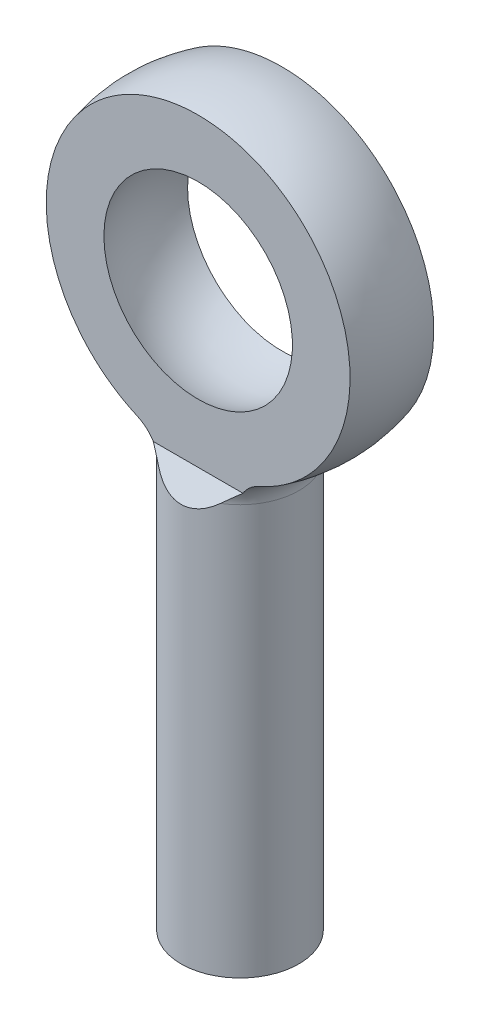
ISO-10303-21;
HEADER;
FILE_DESCRIPTION(('STEP AP214'),'2;1');
FILE_NAME('part.step','',(''),(''),'','','');
FILE_SCHEMA(('AUTOMOTIVE_DESIGN { 1 0 10303 214 1 1 1 1 }'));
ENDSEC;
DATA;
#1=APPLICATION_CONTEXT('core data for automotive mechanical design processes');
#2=APPLICATION_PROTOCOL_DEFINITION('international standard','automotive_design',2000,#1);
#3=PRODUCT_CONTEXT('',#1,'mechanical');
#4=PRODUCT('Part','Part','',(#3));
#5=PRODUCT_RELATED_PRODUCT_CATEGORY('part','',(#4));
#6=PRODUCT_DEFINITION_FORMATION('','',#4);
#7=PRODUCT_DEFINITION_CONTEXT('part definition',#1,'design');
#8=PRODUCT_DEFINITION('design','',#6,#7);
#9=PRODUCT_DEFINITION_SHAPE('','',#8);
#10=(LENGTH_UNIT() NAMED_UNIT(*) SI_UNIT(.MILLI.,.METRE.));
#11=(NAMED_UNIT(*) PLANE_ANGLE_UNIT() SI_UNIT($,.RADIAN.));
#12=(NAMED_UNIT(*) SI_UNIT($,.STERADIAN.) SOLID_ANGLE_UNIT());
#13=UNCERTAINTY_MEASURE_WITH_UNIT(LENGTH_MEASURE(1.E-05),#10,'distance_accuracy_value','');
#14=(GEOMETRIC_REPRESENTATION_CONTEXT(3) GLOBAL_UNCERTAINTY_ASSIGNED_CONTEXT((#13)) GLOBAL_UNIT_ASSIGNED_CONTEXT((#10,
#11,#12)) REPRESENTATION_CONTEXT('',''));
#15=CARTESIAN_POINT('',(0.,0.,0.));
#16=DIRECTION('',(0.,0.,1.));
#17=DIRECTION('',(1.,0.,0.));
#18=AXIS2_PLACEMENT_3D('',#15,#16,#17);
#19=CARTESIAN_POINT('',(0.,-17.7621611582037,0.));
#20=DIRECTION('',(0.,1.,0.));
#21=DIRECTION('',(0.,0.,1.));
#22=AXIS2_PLACEMENT_3D('',#19,#20,#21);
#23=TOROIDAL_SURFACE('',#22,9.525,3.175);
#24=CARTESIAN_POINT('',(0.,-17.7621611582037,0.));
#25=DIRECTION('',(0.,1.,0.));
#26=DIRECTION('',(0.,0.,1.));
#27=AXIS2_PLACEMENT_3D('',#24,#25,#26);
#28=CIRCLE('',#27,6.35);
#29=CARTESIAN_POINT('',(-3.31135697232038,-17.7621611582037,5.4182483333514));
#30=VERTEX_POINT('',#29);
#31=CARTESIAN_POINT('',(-3.31135697232055,-17.7621611582037,-5.41824833335146));
#32=VERTEX_POINT('',#31);
#33=EDGE_CURVE('E52',#30,#32,#28,.F.);
#34=ORIENTED_EDGE('',*,*,#33,.F.);
#35=CARTESIAN_POINT('',(-3.31135697232041,-17.7621611582037,5.41824833335146));
#36=CARTESIAN_POINT('',(-3.37399479614984,-17.7094777809787,5.37997161927855));
#37=CARTESIAN_POINT('',(-3.43666327533003,-17.6568182437544,5.34171222597998));
#38=CARTESIAN_POINT('',(-3.56208043123366,-17.5515616813184,5.26523885701859));
#39=CARTESIAN_POINT('',(-3.62482910798698,-17.4989646561301,5.2270248813727));
#40=CARTESIAN_POINT('',(-3.81321713892942,-17.3412951424375,5.11247127430517));
#41=CARTESIAN_POINT('',(-3.93900502902345,-17.2363387127528,5.03621596455157));
#42=CARTESIAN_POINT('',(-4.19141383381767,-17.0270668767203,4.88417107576023));
#43=CARTESIAN_POINT('',(-4.31803480477981,-16.9227515146065,4.80838152886028));
#44=CARTESIAN_POINT('',(-4.50908405551715,-16.7671702853479,4.69534514924452));
#45=CARTESIAN_POINT('',(-4.57295510935747,-16.7154571814585,4.65777338001371));
#46=CARTESIAN_POINT('',(-4.70117353200961,-16.61241675655,4.58291012921392));
#47=CARTESIAN_POINT('',(-4.76552091163035,-16.5610894443389,4.5456186540444));
#48=CARTESIAN_POINT('',(-4.83015739362694,-16.51,4.50849999999999));
#49=B_SPLINE_CURVE_WITH_KNOTS('',3,(#35,#36,#37,#38,#39,#40,#41,#42,#43,#44,#45,#46,#47,#48),
.UNSPECIFIED.,.F.,.F.,(4,2,2,2,2,2,4),(0.,0.271066926688794,0.542133954406597,1.0842397114432,
1.62638246317459,1.89746790245729,2.16855951226304),.UNSPECIFIED.);
#50=CARTESIAN_POINT('',(-4.83015739362695,-16.51,4.5085));
#51=VERTEX_POINT('',#50);
#52=EDGE_CURVE('E11',#30,#51,#49,.T.);
#53=ORIENTED_EDGE('',*,*,#52,.T.);
#54=CARTESIAN_POINT('',(-6.16545883786719,-15.2087404092014,4.5085));
#55=CARTESIAN_POINT('',(-6.39747792969346,-15.0703287491793,4.5085));
#56=CARTESIAN_POINT('',(-6.6424833659026,-14.9532295695286,4.5085));
#57=CARTESIAN_POINT('',(-7.15016043486367,-14.7650395092169,4.5085));
#58=CARTESIAN_POINT('',(-7.41286385593849,-14.6940339905938,4.5085));
#59=CARTESIAN_POINT('',(-7.80238822981815,-14.627162949999,4.5085));
#60=CARTESIAN_POINT('',(-7.92602924344628,-14.6114265458933,4.5085));
#61=CARTESIAN_POINT('',(-8.17420016248507,-14.5909949832414,4.5085));
#62=CARTESIAN_POINT('',(-8.29872958173183,-14.5862941904753,4.5085));
#63=CARTESIAN_POINT('',(-8.54763040188495,-14.5882907404155,4.5085));
#64=CARTESIAN_POINT('',(-8.67200185178085,-14.5949819427842,4.5085));
#65=CARTESIAN_POINT('',(-8.91950890592156,-14.6200453070675,4.5085));
#66=CARTESIAN_POINT('',(-9.04264517004066,-14.6384108529733,4.5085));
#67=CARTESIAN_POINT('',(-9.2775476031347,-14.6852344528183,4.5085));
#68=CARTESIAN_POINT('',(-9.38948225839889,-14.7128477046445,4.5085));
#69=CARTESIAN_POINT('',(-9.61025618041148,-14.7783359820044,4.5085));
#70=CARTESIAN_POINT('',(-9.71909709422118,-14.8162054297824,4.5085));
#71=CARTESIAN_POINT('',(-9.93264660009551,-14.902177730428,4.5085));
#72=CARTESIAN_POINT('',(-10.0373559071524,-14.9502788033795,4.5085));
#73=CARTESIAN_POINT('',(-10.2415283498363,-15.0565614512913,4.5085));
#74=CARTESIAN_POINT('',(-10.3409921759479,-15.1147416951463,4.5085));
#75=CARTESIAN_POINT('',(-10.5224562233439,-15.2336287835205,4.5085));
#76=CARTESIAN_POINT('',(-10.6051502919678,-15.2932784104027,4.5085));
#77=CARTESIAN_POINT('',(-10.7647098122309,-15.419912919208,4.5085));
#78=CARTESIAN_POINT('',(-10.8415760510067,-15.4868968075304,4.5085));
#79=CARTESIAN_POINT('',(-10.9886532534426,-15.6277561581284,4.5085));
#80=CARTESIAN_POINT('',(-11.0588676656774,-15.7016280095509,4.5085));
#81=CARTESIAN_POINT('',(-11.191893273999,-15.8557184672576,4.5085));
#82=CARTESIAN_POINT('',(-11.2547051031253,-15.935936529857,4.5085));
#83=CARTESIAN_POINT('',(-11.4194256006635,-16.1689324364704,4.5085));
#84=CARTESIAN_POINT('',(-11.5122701234445,-16.3282893607687,4.5085));
#85=CARTESIAN_POINT('',(-11.6677223433645,-16.6610066873543,4.5085));
#86=CARTESIAN_POINT('',(-11.7303433897006,-16.8343608677246,4.5085));
#87=CARTESIAN_POINT('',(-11.819913294388,-17.1783641161651,4.5085));
#88=CARTESIAN_POINT('',(-11.8488663433818,-17.3484918454776,4.5085));
#89=CARTESIAN_POINT('',(-11.8769238026081,-17.6911749893734,4.5085));
#90=CARTESIAN_POINT('',(-11.8760343280854,-17.8637298993416,4.5085));
#91=CARTESIAN_POINT('',(-11.8448855654883,-18.2014612405731,4.5085));
#92=CARTESIAN_POINT('',(-11.8154164336915,-18.3667113250646,4.5085));
#93=CARTESIAN_POINT('',(-11.729341205753,-18.6899658544943,4.5085));
#94=CARTESIAN_POINT('',(-11.67273563613,-18.8479704399491,4.5085));
#95=CARTESIAN_POINT('',(-11.5338652933917,-19.1536426751426,4.5085));
#96=CARTESIAN_POINT('',(-11.4514152108022,-19.3012259286904,4.5085));
#97=CARTESIAN_POINT('',(-11.26378495983,-19.5811244743939,4.5085));
#98=CARTESIAN_POINT('',(-11.1586018764656,-19.7134378051943,4.5085));
#99=CARTESIAN_POINT('',(-10.9243372341191,-19.9647212514913,4.5085));
#100=CARTESIAN_POINT('',(-10.7944847686388,-20.0829714662952,4.5085));
#101=CARTESIAN_POINT('',(-10.5178614366963,-20.2976148863322,4.5085));
#102=CARTESIAN_POINT('',(-10.3710865338922,-20.3940028606455,4.5085));
#103=CARTESIAN_POINT('',(-10.0543642909432,-20.5692869969265,4.5085));
#104=CARTESIAN_POINT('',(-9.88352145009996,-20.6465623446944,4.5085));
#105=CARTESIAN_POINT('',(-9.53204409834785,-20.7740180245993,4.5085));
#106=CARTESIAN_POINT('',(-9.35140608106081,-20.8241885826364,4.5085));
#107=CARTESIAN_POINT('',(-8.96792710453585,-20.9009947930408,4.5085));
#108=CARTESIAN_POINT('',(-8.7645700545202,-20.9250475619082,4.5085));
#109=CARTESIAN_POINT('',(-8.35660866172919,-20.9421614954211,4.5085));
#110=CARTESIAN_POINT('',(-8.15200393996997,-20.935212721583,4.5085));
#111=CARTESIAN_POINT('',(-7.72447404797594,-20.8896016835263,4.5085));
#112=CARTESIAN_POINT('',(-7.50189644862089,-20.8476672470625,4.5085));
#113=CARTESIAN_POINT('',(-7.06569525211152,-20.7302095297835,4.5085));
#114=CARTESIAN_POINT('',(-6.85208052946409,-20.6546537797154,4.5085));
#115=CARTESIAN_POINT('',(-6.41996752284139,-20.4638543301332,4.5085));
#116=CARTESIAN_POINT('',(-6.20275079758965,-20.3456578850861,4.5085));
#117=CARTESIAN_POINT('',(-5.89455461211226,-20.1421586150326,4.5085));
#118=CARTESIAN_POINT('',(-5.79473760036877,-20.0699364267704,4.5085));
#119=CARTESIAN_POINT('',(-5.6019585440046,-19.9168841158886,4.5085));
#120=CARTESIAN_POINT('',(-5.50899400014739,-19.8360571581595,4.5085));
#121=CARTESIAN_POINT('',(-5.29177790081818,-19.6282573168589,4.5085));
#122=CARTESIAN_POINT('',(-5.1718565895703,-19.4966772089044,4.5085));
#123=CARTESIAN_POINT('',(-4.95402204496031,-19.2164812443032,4.5085));
#124=CARTESIAN_POINT('',(-4.85606987442165,-19.0678962439854,4.5085));
#125=CARTESIAN_POINT('',(-4.70703394516282,-18.7889027479916,4.5085));
#126=CARTESIAN_POINT('',(-4.65039841444629,-18.6614830044884,4.5085));
#127=CARTESIAN_POINT('',(-4.55885350027765,-18.3990479328286,4.5085));
#128=CARTESIAN_POINT('',(-4.52391994846356,-18.2640412373109,4.5085));
#129=CARTESIAN_POINT('',(-4.4789096864705,-17.9889621353948,4.5085));
#130=CARTESIAN_POINT('',(-4.46899217047131,-17.8488630128748,4.5085));
#131=CARTESIAN_POINT('',(-4.47562918981098,-17.5693039540311,4.5085));
#132=CARTESIAN_POINT('',(-4.49218312552224,-17.4298440033008,4.5085));
#133=CARTESIAN_POINT('',(-4.5472136035653,-17.168874431419,4.5085));
#134=CARTESIAN_POINT('',(-4.58353113977961,-17.046894391705,4.5085));
#135=CARTESIAN_POINT('',(-4.67368958058588,-16.8095976848496,4.5085));
#136=CARTESIAN_POINT('',(-4.72754560549968,-16.694286868771,4.5085));
#137=CARTESIAN_POINT('',(-4.87812323447343,-16.4201883232059,4.5085));
#138=CARTESIAN_POINT('',(-4.98314911212242,-16.2659665492795,4.5085));
#139=CARTESIAN_POINT('',(-5.21644796255646,-15.9763997025475,4.5085));
#140=CARTESIAN_POINT('',(-5.34474822090185,-15.8410771191767,4.5085));
#141=CARTESIAN_POINT('',(-5.58665692296434,-15.6195091807873,4.5085));
#142=CARTESIAN_POINT('',(-5.69660840755151,-15.5292115850188,4.5085));
#143=CARTESIAN_POINT('',(-5.92499713020108,-15.3602266150745,4.5085));
#144=CARTESIAN_POINT('',(-6.04343192450465,-15.2815359171613,4.5085));
#145=CARTESIAN_POINT('',(-6.16545883786719,-15.2087404092014,4.5085));
#146=B_SPLINE_CURVE_WITH_KNOTS('',3,(#54,#55,#56,#57,#58,#59,#60,#61,#62,#63,#64,#65,#66,#67,
#68,#69,#70,#71,#72,#73,#74,#75,#76,#77,#78,#79,#80,#81,#82,#83,#84,#85,#86,#87,#88,#89,#90,#91,
#92,#93,#94,#95,#96,#97,#98,#99,#100,#101,#102,#103,#104,#105,#106,#107,#108,#109,#110,#111,
#112,#113,#114,#115,#116,#117,#118,#119,#120,#121,#122,#123,#124,#125,#126,#127,#128,#129,#130,
#131,#132,#133,#134,#135,#136,#137,#138,#139,#140,#141,#142,#143,#144,#145),.UNSPECIFIED.,.T.,
.F.,(4,2,2,2,2,2,2,2,2,2,2,2,2,2,2,2,2,2,2,2,2,2,2,2,2,2,2,2,2,2,2,2,2,2,2,2,2,2,2,2,2,2,2,2,2,
4),(0.,0.80992726052827,1.62135019923156,1.99486750842424,2.36819407722996,2.74131948499875,
3.11423362582947,3.45962821251789,3.80483533482773,4.14998245318762,4.49508402440382,
4.80055915644217,5.10599295566839,5.41126752907012,5.71651597763014,6.26666767772972,
6.81657616227147,7.33173376186538,7.84678579747654,8.34799230619742,8.84918909058033,
9.35406507479431,9.85900583613123,10.3836022868464,10.9083241242478,11.4684810111455,
12.0288397583491,12.6406322483167,13.252620880991,13.9292499995096,14.6065339848637,
15.3445875751557,15.7138018809818,16.082880853501,16.6150722662888,17.1463128578546,
17.5630078323864,17.9792379196534,18.3981101570093,18.8169729062645,19.1972665016958,
19.5778888285349,20.1345991108037,20.6919663166787,21.1180574967758,21.5440264240417),.UNSPECIFIED.);
#147=CARTESIAN_POINT('',(-6.63825789700721,-14.9640891421036,4.5085));
#148=VERTEX_POINT('',#147);
#149=EDGE_CURVE('E108',#51,#148,#146,.T.);
#150=ORIENTED_EDGE('',*,*,#149,.T.);
#151=CARTESIAN_POINT('',(0.,-14.9640891421036,0.));
#152=DIRECTION('',(0.,1.,0.));
#153=DIRECTION('',(0.,0.,1.));
#154=AXIS2_PLACEMENT_3D('',#151,#152,#153);
#155=CIRCLE('',#154,8.02452741020794);
#156=CARTESIAN_POINT('',(-6.63825789700721,-14.9640891421036,-4.5085));
#157=VERTEX_POINT('',#156);
#158=EDGE_CURVE('E107',#157,#148,#155,.T.);
#159=ORIENTED_EDGE('',*,*,#158,.F.);
#160=CARTESIAN_POINT('',(-6.16545883786719,-15.2087404092014,-4.5085));
#161=CARTESIAN_POINT('',(-5.97817013156669,-15.3204567996102,-4.5085));
#162=CARTESIAN_POINT('',(-5.79922028332427,-15.4461202276516,-4.5085));
#163=CARTESIAN_POINT('',(-5.4635484469151,-15.7243402766155,-4.5085));
#164=CARTESIAN_POINT('',(-5.30679981739255,-15.87686416325,-4.5085));
#165=CARTESIAN_POINT('',(-5.05965610886861,-16.1658233863175,-4.5085));
#166=CARTESIAN_POINT('',(-4.96252339100388,-16.2964894418244,-4.5085));
#167=CARTESIAN_POINT('',(-4.79005901113916,-16.5715217143933,-4.5085));
#168=CARTESIAN_POINT('',(-4.71469191171315,-16.7158651479601,-4.5085));
#169=CARTESIAN_POINT('',(-4.60293873887205,-16.9886508619422,-4.5085));
#170=CARTESIAN_POINT('',(-4.56195044486384,-17.115192754878,-4.5085));
#171=CARTESIAN_POINT('',(-4.5017715277369,-17.3733574214934,-4.5085));
#172=CARTESIAN_POINT('',(-4.48255985044441,-17.5049751601626,-4.5085));
#173=CARTESIAN_POINT('',(-4.46775713512253,-17.7699565742929,-4.5085));
#174=CARTESIAN_POINT('',(-4.47223683964055,-17.9033242912099,-4.5085));
#175=CARTESIAN_POINT('',(-4.50451434704102,-18.1672073220551,-4.5085));
#176=CARTESIAN_POINT('',(-4.53232387814995,-18.2977211674357,-4.5085));
#177=CARTESIAN_POINT('',(-4.60738828420732,-18.5480916315447,-4.5085));
#178=CARTESIAN_POINT('',(-4.65395410824561,-18.6681593626677,-4.5085));
#179=CARTESIAN_POINT('',(-4.76336998534201,-18.9005857795138,-4.5085));
#180=CARTESIAN_POINT('',(-4.82623103494804,-19.0129391943528,-4.5085));
#181=CARTESIAN_POINT('',(-5.00296392045285,-19.2874976448858,-4.5085));
#182=CARTESIAN_POINT('',(-5.12603554844687,-19.4437937236247,-4.5085));
#183=CARTESIAN_POINT('',(-5.3955762020621,-19.7347125406875,-4.5085));
#184=CARTESIAN_POINT('',(-5.54208991877371,-19.8692928745244,-4.5085));
#185=CARTESIAN_POINT('',(-5.85625495759156,-20.1188375901962,-4.5085));
#186=CARTESIAN_POINT('',(-6.02430419147463,-20.2332986575418,-4.5085));
#187=CARTESIAN_POINT('',(-6.37444589336049,-20.4379162716658,-4.5085));
#188=CARTESIAN_POINT('',(-6.55653446235292,-20.5280795353953,-4.5085));
#189=CARTESIAN_POINT('',(-6.96985723796671,-20.6988148291408,-4.5085));
#190=CARTESIAN_POINT('',(-7.20350143874658,-20.7736086273292,-4.5085));
#191=CARTESIAN_POINT('',(-7.68033556801129,-20.8831762261979,-4.5085));
#192=CARTESIAN_POINT('',(-7.92353103807792,-20.9179264282685,-4.5085));
#193=CARTESIAN_POINT('',(-8.29025870022831,-20.9377588831934,-4.5085));
#194=CARTESIAN_POINT('',(-8.41308056498709,-20.9389562571525,-4.5085));
#195=CARTESIAN_POINT('',(-8.65830630326453,-20.9301859698128,-4.5085));
#196=CARTESIAN_POINT('',(-8.78071035239874,-20.9202237899525,-4.5085));
#197=CARTESIAN_POINT('',(-9.02404863619644,-20.8888666545393,-4.5085));
#198=CARTESIAN_POINT('',(-9.14498285673113,-20.8674715891761,-4.5085));
#199=CARTESIAN_POINT('',(-9.38415716182719,-20.8130868330533,-4.5085));
#200=CARTESIAN_POINT('',(-9.50239885751266,-20.7801042809472,-4.5085));
#201=CARTESIAN_POINT('',(-9.72372808431357,-20.7062495851609,-4.5085));
#202=CARTESIAN_POINT('',(-9.82717426223442,-20.6664508044406,-4.5085));
#203=CARTESIAN_POINT('',(-10.0298747480206,-20.577436984092,-4.5085));
#204=CARTESIAN_POINT('',(-10.1291313806268,-20.5282272526459,-4.5085));
#205=CARTESIAN_POINT('',(-10.3224731310494,-20.4205612489626,-4.5085));
#206=CARTESIAN_POINT('',(-10.4165599707295,-20.3621080808303,-4.5085));
#207=CARTESIAN_POINT('',(-10.5985253517225,-20.2362919696614,-4.5085));
#208=CARTESIAN_POINT('',(-10.6864046408211,-20.1689301026189,-4.5085));
#209=CARTESIAN_POINT('',(-10.920108460413,-19.9702945654968,-4.5085));
#210=CARTESIAN_POINT('',(-11.0583126929125,-19.8298169421081,-4.5085));
#211=CARTESIAN_POINT('',(-11.3063008535843,-19.5258217615802,-4.5085));
#212=CARTESIAN_POINT('',(-11.4161023252717,-19.3623185235201,-4.5085));
#213=CARTESIAN_POINT('',(-11.5944535917366,-19.0324664573711,-4.5085));
#214=CARTESIAN_POINT('',(-11.6657671673761,-18.8676112144208,-4.5085));
#215=CARTESIAN_POINT('',(-11.7780012472993,-18.527870542047,-4.5085));
#216=CARTESIAN_POINT('',(-11.8189327045571,-18.3529887517834,-4.5085));
#217=CARTESIAN_POINT('',(-11.8674778697631,-18.0078154944724,-4.5085));
#218=CARTESIAN_POINT('',(-11.8766892870255,-17.8377470519023,-4.5085));
#219=CARTESIAN_POINT('',(-11.8659363357772,-17.4985484710425,-4.5085));
#220=CARTESIAN_POINT('',(-11.8459760263283,-17.3294182054982,-4.5085));
#221=CARTESIAN_POINT('',(-11.7781633497324,-16.9995884683186,-4.5085));
#222=CARTESIAN_POINT('',(-11.7307451299442,-16.8387992874207,-4.5085));
#223=CARTESIAN_POINT('',(-11.6100482229326,-16.5272625063375,-4.5085));
#224=CARTESIAN_POINT('',(-11.5367686810718,-16.3765152382023,-4.5085));
#225=CARTESIAN_POINT('',(-11.3653012532854,-16.0862748535604,-4.5085));
#226=CARTESIAN_POINT('',(-11.2666890888023,-15.9470329074647,-4.5085));
#227=CARTESIAN_POINT('',(-11.0484908089068,-15.6861262858421,-4.5085));
#228=CARTESIAN_POINT('',(-10.928901190166,-15.5644645524885,-4.5085));
#229=CARTESIAN_POINT('',(-10.6661244758492,-15.3356751526693,-4.5085));
#230=CARTESIAN_POINT('',(-10.5220723740328,-15.2295426005258,-4.5085));
#231=CARTESIAN_POINT('',(-10.2192383635342,-15.0409970073168,-4.5085));
#232=CARTESIAN_POINT('',(-10.0604522893676,-14.9585907011488,-4.5085));
#233=CARTESIAN_POINT('',(-9.719911642678,-14.8130107115537,-4.5085));
#234=CARTESIAN_POINT('',(-9.53732874218041,-14.7517781607756,-4.5085));
#235=CARTESIAN_POINT('',(-9.16501042051568,-14.6578366359716,-4.5085));
#236=CARTESIAN_POINT('',(-8.97527266200933,-14.6251370687644,-4.5085));
#237=CARTESIAN_POINT('',(-8.57435519993291,-14.5857397922415,-4.5085));
#238=CARTESIAN_POINT('',(-8.36289529561911,-14.5819019807278,-4.5085));
#239=CARTESIAN_POINT('',(-7.94181248974968,-14.6061959644328,-4.5085));
#240=CARTESIAN_POINT('',(-7.73219079422339,-14.6343473658838,-4.5085));
#241=CARTESIAN_POINT('',(-7.28648817755122,-14.7275792840676,-4.5085));
#242=CARTESIAN_POINT('',(-7.05147642938811,-14.797803591098,-4.5085));
#243=CARTESIAN_POINT('',(-6.59596203570573,-14.9757385979093,-4.5085));
#244=CARTESIAN_POINT('',(-6.37546803807484,-15.0834714046614,-4.5085));
#245=CARTESIAN_POINT('',(-6.16545883786719,-15.2087404092014,-4.5085));
#246=B_SPLINE_CURVE_WITH_KNOTS('',3,(#160,#161,#162,#163,#164,#165,#166,#167,#168,#169,#170,
#171,#172,#173,#174,#175,#176,#177,#178,#179,#180,#181,#182,#183,#184,#185,#186,#187,#188,#189,
#190,#191,#192,#193,#194,#195,#196,#197,#198,#199,#200,#201,#202,#203,#204,#205,#206,#207,#208,
#209,#210,#211,#212,#213,#214,#215,#216,#217,#218,#219,#220,#221,#222,#223,#224,#225,#226,#227,
#228,#229,#230,#231,#232,#233,#234,#235,#236,#237,#238,#239,#240,#241,#242,#243,#244,#245),
.UNSPECIFIED.,.T.,.F.,(4,2,2,2,2,2,2,2,2,2,2,2,2,2,2,2,2,2,2,2,2,2,2,2,2,2,2,2,2,2,2,2,2,2,2,2,
2,2,2,2,2,2,4),(0.,0.653568778452938,1.30634650941227,1.79315355172143,2.27916347810547,
2.67654521095818,3.07354241670418,3.47172572553754,3.87010932666246,4.25502704707091,
4.64020520176044,5.2337377408164,5.82841560457438,6.43633048248299,7.04407713395415,
7.77671072108394,8.50977584553844,8.87783920482858,9.24572185507244,9.61360803881051,
9.98126797676256,10.3133230822216,10.645191443751,10.9769485939271,11.3086657109478,
11.8963804055395,12.483731215251,13.0198238975976,13.555723220654,14.064200322628,
14.5726066799574,15.0731857929573,15.5737814501099,16.0833804326833,16.5930646017283,
17.1275464563667,17.6621798790034,18.2375039162428,18.8130175560274,19.4448901400272,
20.0771502085818,20.8095727515194,21.5424277066035),.UNSPECIFIED.);
#247=CARTESIAN_POINT('',(-4.83015739362694,-16.51,-4.5085));
#248=VERTEX_POINT('',#247);
#249=EDGE_CURVE('E211',#157,#248,#246,.T.);
#250=ORIENTED_EDGE('',*,*,#249,.T.);
#251=CARTESIAN_POINT('',(-4.83015739362695,-16.51,-4.5085));
#252=CARTESIAN_POINT('',(-4.76552091163035,-16.5610894443389,-4.5456186540444));
#253=CARTESIAN_POINT('',(-4.70117353200962,-16.61241675655,-4.58291012921392));
#254=CARTESIAN_POINT('',(-4.57295510935748,-16.7154571814585,-4.65777338001371));
#255=CARTESIAN_POINT('',(-4.50908405551716,-16.7671702853479,-4.69534514924451));
#256=CARTESIAN_POINT('',(-4.31803480477983,-16.9227515146065,-4.80838152886026));
#257=CARTESIAN_POINT('',(-4.1914138338177,-17.0270668767203,-4.88417107576021));
#258=CARTESIAN_POINT('',(-3.93900502902349,-17.2363387127527,-5.03621596455154));
#259=CARTESIAN_POINT('',(-3.81321713892947,-17.3412951424375,-5.11247127430514));
#260=CARTESIAN_POINT('',(-3.62482910798704,-17.49896465613,-5.22702488137267));
#261=CARTESIAN_POINT('',(-3.56208043123372,-17.5515616813183,-5.26523885701856));
#262=CARTESIAN_POINT('',(-3.43666327533008,-17.6568182437543,-5.34171222597993));
#263=CARTESIAN_POINT('',(-3.37399479614988,-17.7094777809786,-5.37997161927849));
#264=CARTESIAN_POINT('',(-3.31135697232041,-17.7621611582036,-5.41824833335138));
#265=B_SPLINE_CURVE_WITH_KNOTS('',3,(#251,#252,#253,#254,#255,#256,#257,#258,#259,#260,#261,
#262,#263,#264),.UNSPECIFIED.,.F.,.F.,(4,2,2,2,2,2,4),(0.,0.271091609805739,0.542177049088428,
1.0843198008198,1.62642555785637,1.89749258557416,2.16855951226294),.UNSPECIFIED.);
#266=EDGE_CURVE('E134',#248,#32,#265,.T.);
#267=ORIENTED_EDGE('',*,*,#266,.T.);
#268=EDGE_LOOP('',(#34,#53,#150,#159,#250,#267));
#269=FACE_BOUND('',#268,.T.);
#270=ADVANCED_FACE('F33',(#269),#23,.F.);
#271=CARTESIAN_POINT('',(0.,0.,0.));
#272=DIRECTION('',(0.,-1.,0.));
#273=DIRECTION('',(1.,0.,0.));
#274=AXIS2_PLACEMENT_3D('',#271,#272,#273);
#275=SPHERICAL_SURFACE('',#274,16.9799);
#276=ORIENTED_EDGE('',*,*,#158,.T.);
#277=CARTESIAN_POINT('',(0.,0.,4.5085));
#278=DIRECTION('',(0.,0.,-1.));
#279=DIRECTION('',(-1.,0.,0.));
#280=AXIS2_PLACEMENT_3D('',#277,#278,#279);
#281=CIRCLE('',#280,16.3704133044954);
#282=CARTESIAN_POINT('',(6.63825789700721,-14.9640891421036,4.5085));
#283=VERTEX_POINT('',#282);
#284=EDGE_CURVE('E91',#148,#283,#281,.T.);
#285=ORIENTED_EDGE('',*,*,#284,.T.);
#286=CARTESIAN_POINT('',(6.6382578970072,-14.9640891421036,-4.5085));
#287=VERTEX_POINT('',#286);
#288=EDGE_CURVE('E104',#283,#287,#155,.T.);
#289=ORIENTED_EDGE('',*,*,#288,.T.);
#290=CARTESIAN_POINT('',(0.,0.,-4.5085));
#291=DIRECTION('',(0.,0.,1.));
#292=DIRECTION('',(1.,0.,0.));
#293=AXIS2_PLACEMENT_3D('',#290,#291,#292);
#294=CIRCLE('',#293,16.3704133044954);
#295=EDGE_CURVE('E188',#287,#157,#294,.T.);
#296=ORIENTED_EDGE('',*,*,#295,.T.);
#297=EDGE_LOOP('',(#276,#285,#289,#296));
#298=FACE_BOUND('',#297,.T.);
#299=ADVANCED_FACE('F102',(#298),#275,.T.);
#300=CARTESIAN_POINT('',(0.,16.9809,0.));
#301=DIRECTION('',(0.,-1.,0.));
#302=DIRECTION('',(0.,0.,-1.));
#303=AXIS2_PLACEMENT_3D('',#300,#301,#302);
#304=CYLINDRICAL_SURFACE('',#303,6.35);
#305=CARTESIAN_POINT('',(3.31135697232037,-17.7621611582037,-5.4182483333514));
#306=VERTEX_POINT('',#305);
#307=CARTESIAN_POINT('',(3.31135697232055,-17.7621611582037,5.41824833335146));
#308=VERTEX_POINT('',#307);
#309=EDGE_CURVE('E113',#306,#308,#28,.F.);
#310=ORIENTED_EDGE('',*,*,#309,.T.);
#311=CARTESIAN_POINT('',(0.,-10.3045821115558,0.));
#312=DIRECTION('',(0.,-0.587785252292478,-0.809016994374944));
#313=DIRECTION('',(0.,-0.809016994374944,0.587785252292478));
#314=AXIS2_PLACEMENT_3D('',#311,#312,#313);
#315=ELLIPSE('',#314,10.8032652660708,6.35);
#316=EDGE_CURVE('E47',#308,#30,#315,.T.);
#317=ORIENTED_EDGE('',*,*,#316,.T.);
#318=ORIENTED_EDGE('',*,*,#33,.T.);
#319=CARTESIAN_POINT('',(0.,-10.3045821115558,0.));
#320=DIRECTION('',(0.,0.587785252292478,-0.809016994374944));
#321=DIRECTION('',(0.,-0.809016994374944,-0.587785252292478));
#322=AXIS2_PLACEMENT_3D('',#319,#320,#321);
#323=ELLIPSE('',#322,10.8032652660708,6.35);
#324=EDGE_CURVE('E126',#32,#306,#323,.F.);
#325=ORIENTED_EDGE('',*,*,#324,.T.);
#326=EDGE_LOOP('',(#310,#317,#318,#325));
#327=FACE_BOUND('',#326,.T.);
#328=CARTESIAN_POINT('',(0.,-61.9252,0.));
#329=DIRECTION('',(0.,1.,0.));
#330=DIRECTION('',(0.,0.,1.));
#331=AXIS2_PLACEMENT_3D('',#328,#329,#330);
#332=CIRCLE('',#331,6.35);
#333=CARTESIAN_POINT('',(0.,-61.9252,6.35));
#334=VERTEX_POINT('',#333);
#335=EDGE_CURVE('E214',#334,#334,#332,.T.);
#336=ORIENTED_EDGE('',*,*,#335,.T.);
#337=EDGE_LOOP('',(#336));
#338=FACE_BOUND('',#337,.T.);
#339=ADVANCED_FACE('F158',(#327,#338),#304,.T.);
#340=CARTESIAN_POINT('',(0.,-61.9252,0.));
#341=DIRECTION('',(0.,1.,0.));
#342=DIRECTION('',(0.,0.,1.));
#343=AXIS2_PLACEMENT_3D('',#340,#341,#342);
#344=PLANE('',#343);
#345=ORIENTED_EDGE('',*,*,#335,.F.);
#346=EDGE_LOOP('',(#345));
#347=FACE_BOUND('',#346,.T.);
#348=ADVANCED_FACE('F162',(#347),#344,.F.);
#349=ORIENTED_EDGE('',*,*,#288,.F.);
#350=CARTESIAN_POINT('',(4.53730437201906,-17.2214443500796,4.5085));
#351=CARTESIAN_POINT('',(4.50559675064993,-17.351646393446,4.5085));
#352=CARTESIAN_POINT('',(4.48490613787411,-17.4846466098429,4.5085));
#353=CARTESIAN_POINT('',(4.46769724835475,-17.7522133170263,4.5085));
#354=CARTESIAN_POINT('',(4.47117898267375,-17.8867798085295,4.5085));
#355=CARTESIAN_POINT('',(4.50189167097943,-18.1527952003833,4.5085));
#356=CARTESIAN_POINT('',(4.5290666153823,-18.2842507027116,4.5085));
#357=CARTESIAN_POINT('',(4.60453240628624,-18.5409380587227,4.5085));
#358=CARTESIAN_POINT('',(4.65284461854986,-18.6661634719554,4.5085));
#359=CARTESIAN_POINT('',(4.78485062404115,-18.9457327930471,4.5085));
#360=CARTESIAN_POINT('',(4.87486921772209,-19.0970753957598,4.5085));
#361=CARTESIAN_POINT('',(5.07801531994279,-19.383366708594,4.5085));
#362=CARTESIAN_POINT('',(5.19118923857216,-19.5182816126945,4.5085));
#363=CARTESIAN_POINT('',(5.47333170490752,-19.8104690860764,4.5085));
#364=CARTESIAN_POINT('',(5.64868786214075,-19.9615694596644,4.5085));
#365=CARTESIAN_POINT('',(6.02145256917883,-20.2332802970718,4.5085));
#366=CARTESIAN_POINT('',(6.21887292343461,-20.3538743261751,4.5085));
#367=CARTESIAN_POINT('',(6.63255106291192,-20.5644031993608,4.5085));
#368=CARTESIAN_POINT('',(6.8490151147743,-20.6539319661231,4.5085));
#369=CARTESIAN_POINT('',(7.29344147837811,-20.7978944782402,4.5085));
#370=CARTESIAN_POINT('',(7.52140251099102,-20.852332118509,4.5085));
#371=CARTESIAN_POINT('',(7.87502788053025,-20.9068332452827,4.5085));
#372=CARTESIAN_POINT('',(7.99873591312226,-20.9204176271391,4.5085));
#373=CARTESIAN_POINT('',(8.24685421406396,-20.9365052475243,4.5085));
#374=CARTESIAN_POINT('',(8.37126415357918,-20.9390133031413,4.5085));
#375=CARTESIAN_POINT('',(8.61984461707304,-20.9325992661739,4.5085));
#376=CARTESIAN_POINT('',(8.74401501598613,-20.9236722874467,4.5085));
#377=CARTESIAN_POINT('',(8.99089610950852,-20.8941010698355,4.5085));
#378=CARTESIAN_POINT('',(9.11360762430539,-20.873463766766,4.5085));
#379=CARTESIAN_POINT('',(9.34688982387709,-20.8223745486991,4.5085));
#380=CARTESIAN_POINT('',(9.45765728280811,-20.7928204397503,4.5085));
#381=CARTESIAN_POINT('',(9.67592036955189,-20.723562767648,4.5085));
#382=CARTESIAN_POINT('',(9.78341773902765,-20.6838647169911,4.5085));
#383=CARTESIAN_POINT('',(9.99408773497343,-20.5943795515876,4.5085));
#384=CARTESIAN_POINT('',(10.0972620204378,-20.544596350639,4.5085));
#385=CARTESIAN_POINT('',(10.298208162077,-20.4351122751223,4.5085));
#386=CARTESIAN_POINT('',(10.3959807273697,-20.3754127064804,4.5085));
#387=CARTESIAN_POINT('',(10.5741217498058,-20.253839581775,4.5085));
#388=CARTESIAN_POINT('',(10.6551993509744,-20.1930033230435,4.5085));
#389=CARTESIAN_POINT('',(10.8114319959651,-20.0641578387489,4.5085));
#390=CARTESIAN_POINT('',(10.8865878286133,-19.9961495713855,4.5085));
#391=CARTESIAN_POINT('',(11.030171241179,-19.8534156835295,4.5085));
#392=CARTESIAN_POINT('',(11.0986020585359,-19.7786933287105,4.5085));
#393=CARTESIAN_POINT('',(11.2280053300276,-19.6230893288153,4.5085));
#394=CARTESIAN_POINT('',(11.2889784026399,-19.5422081953958,4.5085));
#395=CARTESIAN_POINT('',(11.4486674397686,-19.3073785479472,4.5085));
#396=CARTESIAN_POINT('',(11.5382356416717,-19.1470414928499,4.5085));
#397=CARTESIAN_POINT('',(11.6870778568169,-18.8129921966422,4.5085));
#398=CARTESIAN_POINT('',(11.746364901622,-18.6392857461781,4.5085));
#399=CARTESIAN_POINT('',(11.8296430269551,-18.2948872942355,4.5085));
#400=CARTESIAN_POINT('',(11.8555771241424,-18.1246646498708,4.5085));
#401=CARTESIAN_POINT('',(11.877682379771,-17.782314439603,4.5085));
#402=CARTESIAN_POINT('',(11.8738593646017,-17.6101872531963,4.5085));
#403=CARTESIAN_POINT('',(11.8370848155396,-17.2734790812967,4.5085));
#404=CARTESIAN_POINT('',(11.8048677078062,-17.1088171614612,4.5085));
#405=CARTESIAN_POINT('',(11.7134781308631,-16.7871722667107,4.5085));
#406=CARTESIAN_POINT('',(11.6543059497719,-16.6301892097375,4.5085));
#407=CARTESIAN_POINT('',(11.5104286075798,-16.3266968637211,4.5085));
#408=CARTESIAN_POINT('',(11.4254992691547,-16.1802941051637,4.5085));
#409=CARTESIAN_POINT('',(11.2331662681355,-15.9031149157353,4.5085));
#410=CARTESIAN_POINT('',(11.1257595761723,-15.7723405949119,4.5085));
#411=CARTESIAN_POINT('',(10.8870993990258,-15.524306096154,4.5085));
#412=CARTESIAN_POINT('',(10.7550575424692,-15.4078057563286,4.5085));
#413=CARTESIAN_POINT('',(10.4743773982638,-15.1969529789322,4.5085));
#414=CARTESIAN_POINT('',(10.3257350918683,-15.1026059215995,4.5085));
#415=CARTESIAN_POINT('',(10.005307229902,-14.9316531167429,4.5085));
#416=CARTESIAN_POINT('',(9.83263286952831,-14.8567161463459,4.5085));
#417=CARTESIAN_POINT('',(9.4778790563483,-14.7341611814686,4.5085));
#418=CARTESIAN_POINT('',(9.29579615189839,-14.6865532916908,4.5085));
#419=CARTESIAN_POINT('',(8.90951731549516,-14.6152294397143,4.5085));
#420=CARTESIAN_POINT('',(8.70483744424746,-14.5941408663284,4.5085));
#421=CARTESIAN_POINT('',(8.29469470384807,-14.5831130112814,4.5085));
#422=CARTESIAN_POINT('',(8.08923160989092,-14.5931834709175,4.5085));
#423=CARTESIAN_POINT('',(7.66034111482524,-14.6454794612311,4.5085));
#424=CARTESIAN_POINT('',(7.4373130372791,-14.6909943525884,4.5085));
#425=CARTESIAN_POINT('',(7.00078173352539,-14.8157148102266,4.5085));
#426=CARTESIAN_POINT('',(6.78728820695822,-14.8949538590944,4.5085));
#427=CARTESIAN_POINT('',(6.35661072554766,-15.0933323016517,4.5085));
#428=CARTESIAN_POINT('',(6.14072908975694,-15.2153490703349,4.5085));
#429=CARTESIAN_POINT('',(5.83517739320491,-15.4246065434453,4.5085));
#430=CARTESIAN_POINT('',(5.73634246945539,-15.4987597829852,4.5085));
#431=CARTESIAN_POINT('',(5.54580134588425,-15.655693293331,4.5085));
#432=CARTESIAN_POINT('',(5.45409219004174,-15.7384699531178,4.5085));
#433=CARTESIAN_POINT('',(5.24314795793587,-15.9482807331083,4.5085));
#434=CARTESIAN_POINT('',(5.12805033363899,-16.0795423007122,4.5085));
#435=CARTESIAN_POINT('',(4.9198584430872,-16.3582139281205,4.5085));
#436=CARTESIAN_POINT('',(4.82669713574301,-16.505572716553,4.5085));
#437=CARTESIAN_POINT('',(4.70228213222978,-16.7493497975664,4.5085));
#438=CARTESIAN_POINT('',(4.66151129589494,-16.8409468928131,4.5085));
#439=CARTESIAN_POINT('',(4.5908736398182,-17.0283219504703,4.5085));
#440=CARTESIAN_POINT('',(4.56101000691643,-17.124101125654,4.5085));
#441=CARTESIAN_POINT('',(4.53730437201906,-17.2214443500796,4.5085));
#442=B_SPLINE_CURVE_WITH_KNOTS('',3,(#350,#351,#352,#353,#354,#355,#356,#357,#358,#359,#360,
#361,#362,#363,#364,#365,#366,#367,#368,#369,#370,#371,#372,#373,#374,#375,#376,#377,#378,#379,
#380,#381,#382,#383,#384,#385,#386,#387,#388,#389,#390,#391,#392,#393,#394,#395,#396,#397,#398,
#399,#400,#401,#402,#403,#404,#405,#406,#407,#408,#409,#410,#411,#412,#413,#414,#415,#416,#417,
#418,#419,#420,#421,#422,#423,#424,#425,#426,#427,#428,#429,#430,#431,#432,#433,#434,#435,#436,
#437,#438,#439,#440,#441),.UNSPECIFIED.,.T.,.F.,(4,2,2,2,2,2,2,2,2,2,2,2,2,2,2,2,2,2,2,2,2,2,2,
2,2,2,2,2,2,2,2,2,2,2,2,2,2,2,2,2,2,2,2,2,2,4),(0.,0.401645215953345,0.803290615720736,
1.20398911199259,1.60509357748088,2.1304897885097,2.65694954963151,3.34778926944441,
4.03900037726622,4.73893358626127,5.43878909329826,5.81172942367982,6.18450754653563,
6.55744500908504,6.93016181768915,7.27361502395415,7.61688198377232,7.96001598446876,
8.30310483224657,8.60678676494717,8.91042817620119,9.21392269021517,9.51739201807224,
10.0652481198902,10.6128682515473,11.1268771291933,11.6407853673512,12.1417788779137,
12.6427670335629,13.1482471601197,13.6537954563205,14.1797767648119,14.7058856834909,
15.2682180994026,15.8307582993984,16.4455061214305,17.0604461524512,17.7404484621881,
18.4211274840434,19.1611770107688,19.53144530282,19.9015591651795,20.4234722553204,
20.9437689649857,21.2439641727035,21.544247020692),.UNSPECIFIED.);
#443=CARTESIAN_POINT('',(4.83015739362695,-16.51,4.5085));
#444=VERTEX_POINT('',#443);
#445=EDGE_CURVE('E87',#283,#444,#442,.T.);
#446=ORIENTED_EDGE('',*,*,#445,.T.);
#447=CARTESIAN_POINT('',(4.83015739362695,-16.51,4.5085));
#448=CARTESIAN_POINT('',(4.76552091163036,-16.5610894443389,4.5456186540444));
#449=CARTESIAN_POINT('',(4.70117353200962,-16.6124167565499,4.58291012921392));
#450=CARTESIAN_POINT('',(4.57295510935748,-16.7154571814585,4.6577733800137));
#451=CARTESIAN_POINT('',(4.50908405551717,-16.7671702853479,4.69534514924451));
#452=CARTESIAN_POINT('',(4.31803480477983,-16.9227515146065,4.80838152886026));
#453=CARTESIAN_POINT('',(4.1914138338177,-17.0270668767203,4.88417107576021));
#454=CARTESIAN_POINT('',(3.93900502902349,-17.2363387127527,5.03621596455154));
#455=CARTESIAN_POINT('',(3.81321713892947,-17.3412951424375,5.11247127430513));
#456=CARTESIAN_POINT('',(3.62482910798704,-17.49896465613,5.22702488137267));
#457=CARTESIAN_POINT('',(3.56208043123372,-17.5515616813183,5.26523885701856));
#458=CARTESIAN_POINT('',(3.43666327533008,-17.6568182437543,5.34171222597993));
#459=CARTESIAN_POINT('',(3.37399479614989,-17.7094777809786,5.37997161927849));
#460=CARTESIAN_POINT('',(3.31135697232042,-17.7621611582036,5.41824833335138));
#461=B_SPLINE_CURVE_WITH_KNOTS('',3,(#447,#448,#449,#450,#451,#452,#453,#454,#455,#456,#457,
#458,#459,#460),.UNSPECIFIED.,.F.,.F.,(4,2,2,2,2,2,4),(0.,0.271091609805739,0.542177049088429,
1.0843198008198,1.62642555785637,1.89749258557416,2.16855951226294),.UNSPECIFIED.);
#462=EDGE_CURVE('E192',#444,#308,#461,.T.);
#463=ORIENTED_EDGE('',*,*,#462,.T.);
#464=ORIENTED_EDGE('',*,*,#309,.F.);
#465=CARTESIAN_POINT('',(3.31135697232041,-17.7621611582037,-5.41824833335146));
#466=CARTESIAN_POINT('',(3.37399479614985,-17.7094777809787,-5.37997161927854));
#467=CARTESIAN_POINT('',(3.43666327533005,-17.6568182437543,-5.34171222597996));
#468=CARTESIAN_POINT('',(3.56208043123371,-17.5515616813183,-5.26523885701856));
#469=CARTESIAN_POINT('',(3.62482910798705,-17.49896465613,-5.22702488137266));
#470=CARTESIAN_POINT('',(3.81321713892953,-17.3412951424374,-5.1124712743051));
#471=CARTESIAN_POINT('',(3.93900502902358,-17.2363387127526,-5.03621596455149));
#472=CARTESIAN_POINT('',(4.19141383381786,-17.0270668767202,-4.88417107576011));
#473=CARTESIAN_POINT('',(4.31803480478003,-16.9227515146063,-4.80838152886014));
#474=CARTESIAN_POINT('',(4.50908405551742,-16.7671702853477,-4.69534514924436));
#475=CARTESIAN_POINT('',(4.57295510935775,-16.7154571814583,-4.65777338001355));
#476=CARTESIAN_POINT('',(4.70117353200992,-16.6124167565497,-4.58291012921374));
#477=CARTESIAN_POINT('',(4.76552091163068,-16.5610894443387,-4.54561865404421));
#478=CARTESIAN_POINT('',(4.83015739362728,-16.5099999999997,-4.50849999999979));
#479=B_SPLINE_CURVE_WITH_KNOTS('',3,(#465,#466,#467,#468,#469,#470,#471,#472,#473,#474,#475,
#476,#477,#478),.UNSPECIFIED.,.F.,.F.,(4,2,2,2,2,2,4),(0.,0.271066926688854,0.542133954406717,
1.08423971144344,1.62638246317495,1.89746790245772,2.16855951226353),.UNSPECIFIED.);
#480=CARTESIAN_POINT('',(4.83015739362709,-16.5099999999997,-4.5085));
#481=VERTEX_POINT('',#480);
#482=EDGE_CURVE('E129',#306,#481,#479,.T.);
#483=ORIENTED_EDGE('',*,*,#482,.T.);
#484=CARTESIAN_POINT('',(4.53730437201906,-17.2214443500796,-4.5085));
#485=CARTESIAN_POINT('',(4.55726101510595,-17.1395426471964,-4.5085));
#486=CARTESIAN_POINT('',(4.58157763909151,-17.0586821718249,-4.5085));
#487=CARTESIAN_POINT('',(4.63813015694195,-16.8997634611237,-4.5085));
#488=CARTESIAN_POINT('',(4.6703727694007,-16.8217076679048,-4.5085));
#489=CARTESIAN_POINT('',(4.77796506765776,-16.5919288526805,-4.5085));
#490=CARTESIAN_POINT('',(4.86404416227829,-16.4451134074628,-4.5085));
#491=CARTESIAN_POINT('',(5.01986909013132,-16.2216141742962,-4.5085));
#492=CARTESIAN_POINT('',(5.08282164326699,-16.1399714995283,-4.5085));
#493=CARTESIAN_POINT('',(5.2156319755492,-15.9824885056498,-4.5085));
#494=CARTESIAN_POINT('',(5.2854903011482,-15.9066486465585,-4.5085));
#495=CARTESIAN_POINT('',(5.50385368628539,-15.6880885454723,-4.5085));
#496=CARTESIAN_POINT('',(5.66126441651042,-15.5541648753165,-4.5085));
#497=CARTESIAN_POINT('',(5.99646532759487,-15.3086926562957,-4.5085));
#498=CARTESIAN_POINT('',(6.17455115590107,-15.1975537220484,-4.5085));
#499=CARTESIAN_POINT('',(6.54459343378701,-15.0014866186909,-4.5085));
#500=CARTESIAN_POINT('',(6.73655057842485,-14.9165597641301,-4.5085));
#501=CARTESIAN_POINT('',(7.1658775198299,-14.7617458618023,-4.5085));
#502=CARTESIAN_POINT('',(7.40522161445133,-14.6972800034012,-4.5085));
#503=CARTESIAN_POINT('',(7.89174008771025,-14.6101227754229,-4.5085));
#504=CARTESIAN_POINT('',(8.13891760939698,-14.5874483955741,-4.5085));
#505=CARTESIAN_POINT('',(8.50736336019416,-14.5870236115474,-4.5085));
#506=CARTESIAN_POINT('',(8.62878865369126,-14.5923002575357,-4.5085));
#507=CARTESIAN_POINT('',(8.87063092244817,-14.6139457133708,-4.5085));
#508=CARTESIAN_POINT('',(8.99104835563728,-14.6303091739512,-4.5085));
#509=CARTESIAN_POINT('',(9.22976291959536,-14.6743352893699,-4.5085));
#510=CARTESIAN_POINT('',(9.34806069640538,-14.7019944381195,-4.5085));
#511=CARTESIAN_POINT('',(9.58139802364453,-14.7687187153632,-4.5085));
#512=CARTESIAN_POINT('',(9.69643801192147,-14.8077823030392,-4.5085));
#513=CARTESIAN_POINT('',(9.9102694642102,-14.8926337876315,-4.5085));
#514=CARTESIAN_POINT('',(10.0095066679885,-14.9373001652115,-4.5085));
#515=CARTESIAN_POINT('',(10.2034055236243,-15.0356411350533,-4.5085));
#516=CARTESIAN_POINT('',(10.2980678520729,-15.0893143899795,-4.5085));
#517=CARTESIAN_POINT('',(10.4818120378488,-15.2054154247668,-4.5085));
#518=CARTESIAN_POINT('',(10.570896835473,-15.2678385347991,-4.5085));
#519=CARTESIAN_POINT('',(10.7425229655116,-15.4010529284819,-4.5085));
#520=CARTESIAN_POINT('',(10.8250650408375,-15.4718432597728,-4.5085));
#521=CARTESIAN_POINT('',(11.0439276796597,-15.6794877198474,-4.5085));
#522=CARTESIAN_POINT('',(11.1722663296432,-15.8249737162679,-4.5085));
#523=CARTESIAN_POINT('',(11.3999489559105,-16.1369656270605,-4.5085));
#524=CARTESIAN_POINT('',(11.4993098260382,-16.3034592127106,-4.5085));
#525=CARTESIAN_POINT('',(11.6580311188888,-16.6378501975229,-4.5085));
#526=CARTESIAN_POINT('',(11.7200094395511,-16.8045057403983,-4.5085));
#527=CARTESIAN_POINT('',(11.8135836204735,-17.1461274096061,-4.5085));
#528=CARTESIAN_POINT('',(11.8451893359676,-17.3210908208695,-4.5085));
#529=CARTESIAN_POINT('',(11.876040971664,-17.6657270765169,-4.5085));
#530=CARTESIAN_POINT('',(11.8767047817306,-17.835274449327,-4.5085));
#531=CARTESIAN_POINT('',(11.8492243255343,-18.1720033947109,-4.5085));
#532=CARTESIAN_POINT('',(11.8210832821874,-18.3391852298382,-4.5085));
#533=CARTESIAN_POINT('',(11.7374776253375,-18.6646888705094,-4.5085));
#534=CARTESIAN_POINT('',(11.6823001059674,-18.823084715843,-4.5085));
#535=CARTESIAN_POINT('',(11.5467031403868,-19.1286510197146,-4.5085));
#536=CARTESIAN_POINT('',(11.4662823024933,-19.2758208587983,-4.5085));
#537=CARTESIAN_POINT('',(11.2808052055874,-19.5584858172438,-4.5085));
#538=CARTESIAN_POINT('',(11.1752331844975,-19.6936418520047,-4.5085));
#539=CARTESIAN_POINT('',(10.9439386167727,-19.945402354688,-4.5085));
#540=CARTESIAN_POINT('',(10.8182123383925,-20.0620033789972,-4.5085));
#541=CARTESIAN_POINT('',(10.5432676604167,-20.2800975480444,-4.5085));
#542=CARTESIAN_POINT('',(10.3931587548226,-20.3804662476743,-4.5085));
#543=CARTESIAN_POINT('',(10.0792272362293,-20.5567033853294,-4.5085));
#544=CARTESIAN_POINT('',(9.91540073391071,-20.6325648450511,-4.5085));
#545=CARTESIAN_POINT('',(9.56489939520826,-20.7642107008167,-4.5085));
#546=CARTESIAN_POINT('',(9.37744416044094,-20.8179133406246,-4.5085));
#547=CARTESIAN_POINT('',(8.99657775377568,-20.8962166562388,-4.5085));
#548=CARTESIAN_POINT('',(8.80316411166382,-20.9208050907621,-4.5085));
#549=CARTESIAN_POINT('',(8.39531777068503,-20.9428156559835,-4.5085));
#550=CARTESIAN_POINT('',(8.1807253274116,-20.9372607625313,-4.5085));
#551=CARTESIAN_POINT('',(7.75490224347471,-20.8937781541713,-4.5085));
#552=CARTESIAN_POINT('',(7.54367242495298,-20.8558426425604,-4.5085));
#553=CARTESIAN_POINT('',(7.10748678568976,-20.7441314657177,-4.5085));
#554=CARTESIAN_POINT('',(6.88337873196561,-20.6670474455434,-4.5085));
#555=CARTESIAN_POINT('',(6.44966961017351,-20.478263450407,-4.5085));
#556=CARTESIAN_POINT('',(6.2400942090697,-20.3665040472562,-4.5085));
#557=CARTESIAN_POINT('',(5.93588266788892,-20.1708821633551,-4.5085));
#558=CARTESIAN_POINT('',(5.83360251859552,-20.0986730181713,-4.5085));
#559=CARTESIAN_POINT('',(5.63589802202746,-19.9452863301268,-4.5085));
#560=CARTESIAN_POINT('',(5.54047559852444,-19.864106286776,-4.5085));
#561=CARTESIAN_POINT('',(5.35806674871641,-19.6931659412573,-4.5085));
#562=CARTESIAN_POINT('',(5.27105989220059,-19.6034275255493,-4.5085));
#563=CARTESIAN_POINT('',(5.1069127960839,-19.4154220908187,-4.5085));
#564=CARTESIAN_POINT('',(5.02976479110296,-19.3171618877267,-4.5085));
#565=CARTESIAN_POINT('',(4.87413840537471,-19.0933693422372,-4.5085));
#566=CARTESIAN_POINT('',(4.79804582102651,-18.9661517877644,-4.5085));
#567=CARTESIAN_POINT('',(4.66689671428902,-18.7011891797862,-4.5085));
#568=CARTESIAN_POINT('',(4.61181693934962,-18.5634559666198,-4.5085));
#569=CARTESIAN_POINT('',(4.54821381906628,-18.3504106867747,-4.5085));
#570=CARTESIAN_POINT('',(4.53013327422659,-18.2778765790398,-4.5085));
#571=CARTESIAN_POINT('',(4.50101279254894,-18.1314223794725,-4.5085));
#572=CARTESIAN_POINT('',(4.48996910496747,-18.0575030476502,-4.5085));
#573=CARTESIAN_POINT('',(4.47527222863744,-17.9090455024864,-4.5085));
#574=CARTESIAN_POINT('',(4.47160800465796,-17.8345083808537,-4.5085));
#575=CARTESIAN_POINT('',(4.47175538018555,-17.6854758310632,-4.5085));
#576=CARTESIAN_POINT('',(4.47556276056854,-17.6109804031225,-4.5085));
#577=CARTESIAN_POINT('',(4.48839815852548,-17.4837333232761,-4.5085));
#578=CARTESIAN_POINT('',(4.49564391299901,-17.4307941521975,-4.5085));
#579=CARTESIAN_POINT('',(4.51377999153874,-17.3255792012513,-4.5085));
#580=CARTESIAN_POINT('',(4.52466818063667,-17.2733030513486,-4.5085));
#581=CARTESIAN_POINT('',(4.53730437201906,-17.2214443500796,-4.5085));
#582=B_SPLINE_CURVE_WITH_KNOTS('',3,(#484,#485,#486,#487,#488,#489,#490,#491,#492,#493,#494,
#495,#496,#497,#498,#499,#500,#501,#502,#503,#504,#505,#506,#507,#508,#509,#510,#511,#512,#513,
#514,#515,#516,#517,#518,#519,#520,#521,#522,#523,#524,#525,#526,#527,#528,#529,#530,#531,#532,
#533,#534,#535,#536,#537,#538,#539,#540,#541,#542,#543,#544,#545,#546,#547,#548,#549,#550,#551,
#552,#553,#554,#555,#556,#557,#558,#559,#560,#561,#562,#563,#564,#565,#566,#567,#568,#569,#570,
#571,#572,#573,#574,#575,#576,#577,#578,#579,#580,#581),.UNSPECIFIED.,.T.,.F.,(4,2,2,2,2,2,2,2,
2,2,2,2,2,2,2,2,2,2,2,2,2,2,2,2,2,2,2,2,2,2,2,2,2,2,2,2,2,2,2,2,2,2,2,2,2,2,2,2,4),(0.,
0.252817320715103,0.505849689655786,1.0134979608223,1.32245944870072,1.6314454042423,
2.24882271238145,2.87647802275449,3.5041648052535,4.24431691657537,4.98476985984566,
5.34897081622465,5.71299617465896,6.07690862839384,6.44077193779281,6.76680131896418,
7.09278233425861,7.41859003009655,7.74436067804773,8.3229695068259,8.901240333268,
9.43194731750933,9.96248204095245,10.4686803032312,10.9748219342135,11.4757017729618,
11.9766092304399,12.4888390404422,13.0011638042701,13.540570772019,14.080131197867,
14.6626901522592,15.2454939609938,15.8868416221304,16.528343752469,17.2363622633897,
17.9456009734129,18.320788541906,18.696080952791,19.0704381215443,19.4444985840982,
19.8876436468602,20.3302968977083,20.5542665656394,20.7781167545162,21.0016319490939,
21.2250209636799,21.3851941131491,21.5452735431129),.UNSPECIFIED.);
#583=EDGE_CURVE('E112',#481,#287,#582,.T.);
#584=ORIENTED_EDGE('',*,*,#583,.T.);
#585=EDGE_LOOP('',(#349,#446,#463,#464,#483,#584));
#586=FACE_BOUND('',#585,.T.);
#587=ADVANCED_FACE('F110',(#586),#23,.F.);
#588=CARTESIAN_POINT('',(-19.05,-19.05,-4.5085));
#589=DIRECTION('',(0.,0.,1.));
#590=DIRECTION('',(1.,0.,0.));
#591=AXIS2_PLACEMENT_3D('',#588,#589,#590);
#592=PLANE('',#591);
#593=CARTESIAN_POINT('',(0.,0.,-4.5085));
#594=DIRECTION('',(0.,0.,1.));
#595=DIRECTION('',(1.,0.,0.));
#596=AXIS2_PLACEMENT_3D('',#593,#594,#595);
#597=CIRCLE('',#596,10.1568245037512);
#598=CARTESIAN_POINT('',(10.1568245037512,0.,-4.5085));
#599=VERTEX_POINT('',#598);
#600=EDGE_CURVE('E119',#599,#599,#597,.F.);
#601=ORIENTED_EDGE('',*,*,#600,.F.);
#602=EDGE_LOOP('',(#601));
#603=FACE_BOUND('',#602,.T.);
#604=ORIENTED_EDGE('',*,*,#583,.F.);
#605=DIRECTION('',(-1.,0.,0.));
#606=VECTOR('',#605,1.);
#607=CARTESIAN_POINT('',(-4.4716806404304,-16.51,-4.5085));
#608=LINE('',#607,#606);
#609=EDGE_CURVE('E115',#481,#248,#608,.T.);
#610=ORIENTED_EDGE('',*,*,#609,.T.);
#611=ORIENTED_EDGE('',*,*,#249,.F.);
#612=ORIENTED_EDGE('',*,*,#295,.F.);
#613=EDGE_LOOP('',(#604,#610,#611,#612));
#614=FACE_BOUND('',#613,.T.);
#615=ADVANCED_FACE('F161',(#603,#614),#592,.F.);
#616=CARTESIAN_POINT('',(0.,0.,0.));
#617=DIRECTION('',(0.,-1.,0.));
#618=DIRECTION('',(1.,0.,0.));
#619=AXIS2_PLACEMENT_3D('',#616,#617,#618);
#620=SPHERICAL_SURFACE('',#619,11.1125);
#621=CARTESIAN_POINT('',(0.,0.,0.));
#622=DIRECTION('',(0.,0.,-1.));
#623=DIRECTION('',(-1.,0.,0.));
#624=AXIS2_PLACEMENT_3D('',#621,#622,#623);
#625=SPHERICAL_SURFACE('',#624,11.1125);
#626=CARTESIAN_POINT('',(0.,0.,4.5085));
#627=DIRECTION('',(0.,0.,-1.));
#628=DIRECTION('',(-1.,0.,0.));
#629=AXIS2_PLACEMENT_3D('',#626,#627,#628);
#630=CIRCLE('',#629,10.1568245037512);
#631=CARTESIAN_POINT('',(-10.1568245037512,0.,4.5085));
#632=VERTEX_POINT('',#631);
#633=EDGE_CURVE('E98',#632,#632,#630,.F.);
#634=ORIENTED_EDGE('',*,*,#633,.T.);
#635=EDGE_LOOP('',(#634));
#636=FACE_BOUND('',#635,.T.);
#637=ORIENTED_EDGE('',*,*,#600,.T.);
#638=EDGE_LOOP('',(#637));
#639=FACE_BOUND('',#638,.T.);
#640=ADVANCED_FACE('F151',(#636,#639),#625,.F.);
#641=CARTESIAN_POINT('',(-19.05,-19.05,4.5085));
#642=DIRECTION('',(0.,0.,-1.));
#643=DIRECTION('',(1.,0.,0.));
#644=AXIS2_PLACEMENT_3D('',#641,#642,#643);
#645=PLANE('',#644);
#646=ORIENTED_EDGE('',*,*,#633,.F.);
#647=EDGE_LOOP('',(#646));
#648=FACE_BOUND('',#647,.T.);
#649=ORIENTED_EDGE('',*,*,#149,.F.);
#650=DIRECTION('',(1.,0.,0.));
#651=VECTOR('',#650,1.);
#652=CARTESIAN_POINT('',(-19.05,-16.51,4.5085));
#653=LINE('',#652,#651);
#654=EDGE_CURVE('E94',#51,#444,#653,.T.);
#655=ORIENTED_EDGE('',*,*,#654,.T.);
#656=ORIENTED_EDGE('',*,*,#445,.F.);
#657=ORIENTED_EDGE('',*,*,#284,.F.);
#658=EDGE_LOOP('',(#649,#655,#656,#657));
#659=FACE_BOUND('',#658,.T.);
#660=ADVANCED_FACE('F90',(#648,#659),#645,.F.);
#661=CARTESIAN_POINT('',(-19.05,-19.05,-6.35391802113365));
#662=DIRECTION('',(0.,0.587785252292478,-0.809016994374944));
#663=DIRECTION('',(0.,0.809016994374944,0.587785252292478));
#664=AXIS2_PLACEMENT_3D('',#661,#662,#663);
#665=PLANE('',#664);
#666=ORIENTED_EDGE('',*,*,#266,.F.);
#667=ORIENTED_EDGE('',*,*,#609,.F.);
#668=ORIENTED_EDGE('',*,*,#482,.F.);
#669=ORIENTED_EDGE('',*,*,#324,.F.);
#670=EDGE_LOOP('',(#666,#667,#668,#669));
#671=FACE_BOUND('',#670,.T.);
#672=ADVANCED_FACE('F141',(#671),#665,.T.);
#673=CARTESIAN_POINT('',(-19.05,-16.51,4.5085));
#674=DIRECTION('',(0.,-0.587785252292478,-0.809016994374944));
#675=DIRECTION('',(0.,0.809016994374944,-0.587785252292478));
#676=AXIS2_PLACEMENT_3D('',#673,#674,#675);
#677=PLANE('',#676);
#678=ORIENTED_EDGE('',*,*,#52,.F.);
#679=ORIENTED_EDGE('',*,*,#316,.F.);
#680=ORIENTED_EDGE('',*,*,#462,.F.);
#681=ORIENTED_EDGE('',*,*,#654,.F.);
#682=EDGE_LOOP('',(#678,#679,#680,#681));
#683=FACE_BOUND('',#682,.T.);
#684=ADVANCED_FACE('F35',(#683),#677,.F.);
#685=CLOSED_SHELL('',(#270,#299,#339,#348,#587,#615,#640,#660,#672,#684));
#686=MANIFOLD_SOLID_BREP('B2',#685);
#687=ADVANCED_BREP_SHAPE_REPRESENTATION('',(#18,#686),#14);
#688=SHAPE_DEFINITION_REPRESENTATION(#9,#687);
ENDSEC;
END-ISO-10303-21;
